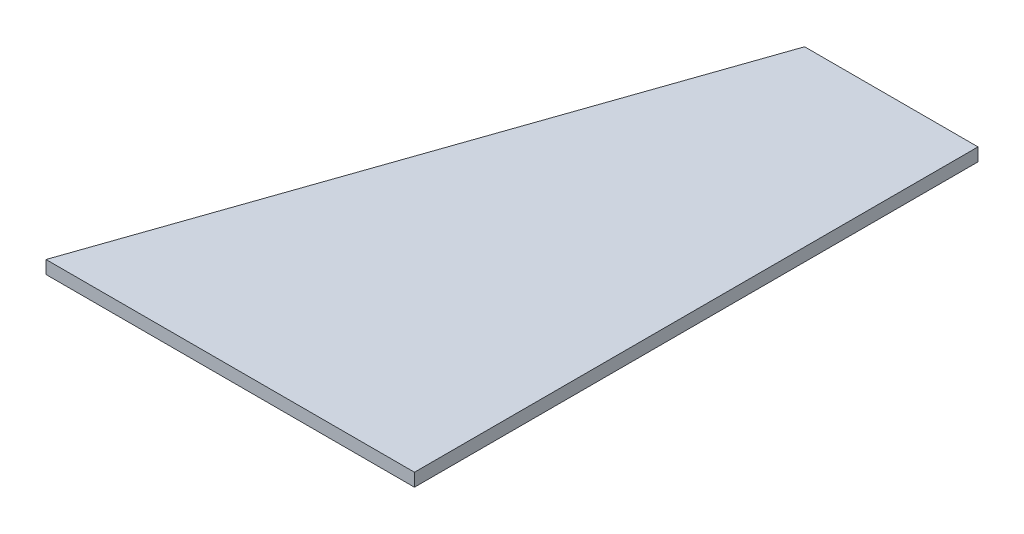
ISO-10303-21;
HEADER;
FILE_DESCRIPTION(('STEP AP214'),'2;1');
FILE_NAME('part.step','',(''),(''),'','','');
FILE_SCHEMA(('AUTOMOTIVE_DESIGN { 1 0 10303 214 1 1 1 1 }'));
ENDSEC;
DATA;
#1=APPLICATION_CONTEXT('core data for automotive mechanical design processes');
#2=APPLICATION_PROTOCOL_DEFINITION('international standard','automotive_design',2000,#1);
#3=PRODUCT_CONTEXT('',#1,'mechanical');
#4=PRODUCT('Part','Part','',(#3));
#5=PRODUCT_RELATED_PRODUCT_CATEGORY('part','',(#4));
#6=PRODUCT_DEFINITION_FORMATION('','',#4);
#7=PRODUCT_DEFINITION_CONTEXT('part definition',#1,'design');
#8=PRODUCT_DEFINITION('design','',#6,#7);
#9=PRODUCT_DEFINITION_SHAPE('','',#8);
#10=(LENGTH_UNIT() NAMED_UNIT(*) SI_UNIT(.MILLI.,.METRE.));
#11=(NAMED_UNIT(*) PLANE_ANGLE_UNIT() SI_UNIT($,.RADIAN.));
#12=(NAMED_UNIT(*) SI_UNIT($,.STERADIAN.) SOLID_ANGLE_UNIT());
#13=UNCERTAINTY_MEASURE_WITH_UNIT(LENGTH_MEASURE(1.E-05),#10,'distance_accuracy_value','');
#14=(GEOMETRIC_REPRESENTATION_CONTEXT(3) GLOBAL_UNCERTAINTY_ASSIGNED_CONTEXT((#13)) GLOBAL_UNIT_ASSIGNED_CONTEXT((#10,
#11,#12)) REPRESENTATION_CONTEXT('',''));
#15=CARTESIAN_POINT('',(0.,0.,0.));
#16=DIRECTION('',(0.,0.,1.));
#17=DIRECTION('',(1.,0.,0.));
#18=AXIS2_PLACEMENT_3D('',#15,#16,#17);
#19=CARTESIAN_POINT('',(1.80411241501588E-13,3.,-260.));
#20=DIRECTION('',(0.,0.,1.));
#21=DIRECTION('',(1.,0.,0.));
#22=AXIS2_PLACEMENT_3D('',#19,#20,#21);
#23=PLANE('',#22);
#24=DIRECTION('',(-1.,0.,0.));
#25=VECTOR('',#24,1.);
#26=CARTESIAN_POINT('',(1.80411241501588E-13,-3.,-260.));
#27=LINE('',#26,#25);
#28=CARTESIAN_POINT('',(170.,-3.,-260.));
#29=VERTEX_POINT('',#28);
#30=CARTESIAN_POINT('',(90.,-3.,-260.));
#31=VERTEX_POINT('',#30);
#32=EDGE_CURVE('E107',#29,#31,#27,.T.);
#33=ORIENTED_EDGE('',*,*,#32,.T.);
#34=DIRECTION('',(0.,-1.,0.));
#35=VECTOR('',#34,1.);
#36=CARTESIAN_POINT('',(90.,3.,-260.));
#37=LINE('',#36,#35);
#38=CARTESIAN_POINT('',(90.,3.,-260.));
#39=VERTEX_POINT('',#38);
#40=EDGE_CURVE('E11',#39,#31,#37,.T.);
#41=ORIENTED_EDGE('',*,*,#40,.F.);
#42=DIRECTION('',(-1.,0.,0.));
#43=VECTOR('',#42,1.);
#44=CARTESIAN_POINT('',(1.80411241501588E-13,3.,-260.));
#45=LINE('',#44,#43);
#46=CARTESIAN_POINT('',(170.,3.,-260.));
#47=VERTEX_POINT('',#46);
#48=EDGE_CURVE('E95',#47,#39,#45,.T.);
#49=ORIENTED_EDGE('',*,*,#48,.F.);
#50=DIRECTION('',(0.,-1.,0.));
#51=VECTOR('',#50,1.);
#52=CARTESIAN_POINT('',(170.,3.,-260.));
#53=LINE('',#52,#51);
#54=EDGE_CURVE('E103',#47,#29,#53,.T.);
#55=ORIENTED_EDGE('',*,*,#54,.T.);
#56=EDGE_LOOP('',(#33,#41,#49,#55));
#57=FACE_BOUND('',#56,.T.);
#58=ADVANCED_FACE('F44',(#57),#23,.F.);
#59=CARTESIAN_POINT('',(0.,3.,0.));
#60=DIRECTION('',(0.944986073440258,0.,0.327110563883166));
#61=DIRECTION('',(0.327110563883166,0.,-0.944986073440258));
#62=AXIS2_PLACEMENT_3D('',#59,#60,#61);
#63=PLANE('',#62);
#64=DIRECTION('',(-0.327110563883166,0.,0.944986073440258));
#65=VECTOR('',#64,1.);
#66=CARTESIAN_POINT('',(0.,-3.,0.));
#67=LINE('',#66,#65);
#68=CARTESIAN_POINT('',(0.,-3.,0.));
#69=VERTEX_POINT('',#68);
#70=EDGE_CURVE('E99',#31,#69,#67,.T.);
#71=ORIENTED_EDGE('',*,*,#70,.T.);
#72=DIRECTION('',(0.,-1.,0.));
#73=VECTOR('',#72,1.);
#74=CARTESIAN_POINT('',(0.,3.,0.));
#75=LINE('',#74,#73);
#76=CARTESIAN_POINT('',(0.,3.,0.));
#77=VERTEX_POINT('',#76);
#78=EDGE_CURVE('E52',#77,#69,#75,.T.);
#79=ORIENTED_EDGE('',*,*,#78,.F.);
#80=DIRECTION('',(-0.327110563883166,0.,0.944986073440258));
#81=VECTOR('',#80,1.);
#82=CARTESIAN_POINT('',(0.,3.,0.));
#83=LINE('',#82,#81);
#84=EDGE_CURVE('E90',#39,#77,#83,.T.);
#85=ORIENTED_EDGE('',*,*,#84,.F.);
#86=ORIENTED_EDGE('',*,*,#40,.T.);
#87=EDGE_LOOP('',(#71,#79,#85,#86));
#88=FACE_BOUND('',#87,.T.);
#89=ADVANCED_FACE('F98',(#88),#63,.F.);
#90=CARTESIAN_POINT('',(0.,3.,0.));
#91=DIRECTION('',(0.,0.,-1.));
#92=DIRECTION('',(-1.,0.,0.));
#93=AXIS2_PLACEMENT_3D('',#90,#91,#92);
#94=PLANE('',#93);
#95=DIRECTION('',(1.,0.,0.));
#96=VECTOR('',#95,1.);
#97=CARTESIAN_POINT('',(0.,-3.,0.));
#98=LINE('',#97,#96);
#99=CARTESIAN_POINT('',(170.,-3.,0.));
#100=VERTEX_POINT('',#99);
#101=EDGE_CURVE('E77',#69,#100,#98,.T.);
#102=ORIENTED_EDGE('',*,*,#101,.T.);
#103=DIRECTION('',(0.,-1.,0.));
#104=VECTOR('',#103,1.);
#105=CARTESIAN_POINT('',(170.,3.,0.));
#106=LINE('',#105,#104);
#107=CARTESIAN_POINT('',(170.,3.,0.));
#108=VERTEX_POINT('',#107);
#109=EDGE_CURVE('E100',#108,#100,#106,.T.);
#110=ORIENTED_EDGE('',*,*,#109,.F.);
#111=DIRECTION('',(1.,0.,0.));
#112=VECTOR('',#111,1.);
#113=CARTESIAN_POINT('',(0.,3.,0.));
#114=LINE('',#113,#112);
#115=EDGE_CURVE('E93',#77,#108,#114,.T.);
#116=ORIENTED_EDGE('',*,*,#115,.F.);
#117=ORIENTED_EDGE('',*,*,#78,.T.);
#118=EDGE_LOOP('',(#102,#110,#116,#117));
#119=FACE_BOUND('',#118,.T.);
#120=ADVANCED_FACE('F101',(#119),#94,.F.);
#121=CARTESIAN_POINT('',(170.,3.,0.));
#122=DIRECTION('',(-1.,0.,0.));
#123=DIRECTION('',(0.,0.,1.));
#124=AXIS2_PLACEMENT_3D('',#121,#122,#123);
#125=PLANE('',#124);
#126=DIRECTION('',(0.,0.,-1.));
#127=VECTOR('',#126,1.);
#128=CARTESIAN_POINT('',(170.,-3.,0.));
#129=LINE('',#128,#127);
#130=EDGE_CURVE('E83',#100,#29,#129,.T.);
#131=ORIENTED_EDGE('',*,*,#130,.T.);
#132=ORIENTED_EDGE('',*,*,#54,.F.);
#133=DIRECTION('',(0.,0.,-1.));
#134=VECTOR('',#133,1.);
#135=CARTESIAN_POINT('',(170.,3.,0.));
#136=LINE('',#135,#134);
#137=EDGE_CURVE('E60',#108,#47,#136,.T.);
#138=ORIENTED_EDGE('',*,*,#137,.F.);
#139=ORIENTED_EDGE('',*,*,#109,.T.);
#140=EDGE_LOOP('',(#131,#132,#138,#139));
#141=FACE_BOUND('',#140,.T.);
#142=ADVANCED_FACE('F114',(#141),#125,.F.);
#143=CARTESIAN_POINT('',(0.,3.,0.));
#144=DIRECTION('',(0.,1.,0.));
#145=DIRECTION('',(0.,0.,1.));
#146=AXIS2_PLACEMENT_3D('',#143,#144,#145);
#147=PLANE('',#146);
#148=ORIENTED_EDGE('',*,*,#48,.T.);
#149=ORIENTED_EDGE('',*,*,#84,.T.);
#150=ORIENTED_EDGE('',*,*,#115,.T.);
#151=ORIENTED_EDGE('',*,*,#137,.T.);
#152=EDGE_LOOP('',(#148,#149,#150,#151));
#153=FACE_BOUND('',#152,.T.);
#154=ADVANCED_FACE('F91',(#153),#147,.T.);
#155=CARTESIAN_POINT('',(0.,-3.,0.));
#156=DIRECTION('',(0.,1.,0.));
#157=DIRECTION('',(0.,0.,1.));
#158=AXIS2_PLACEMENT_3D('',#155,#156,#157);
#159=PLANE('',#158);
#160=ORIENTED_EDGE('',*,*,#32,.F.);
#161=ORIENTED_EDGE('',*,*,#130,.F.);
#162=ORIENTED_EDGE('',*,*,#101,.F.);
#163=ORIENTED_EDGE('',*,*,#70,.F.);
#164=EDGE_LOOP('',(#160,#161,#162,#163));
#165=FACE_BOUND('',#164,.T.);
#166=ADVANCED_FACE('F117',(#165),#159,.F.);
#167=CLOSED_SHELL('',(#58,#89,#120,#142,#154,#166));
#168=MANIFOLD_SOLID_BREP('B2',#167);
#169=ADVANCED_BREP_SHAPE_REPRESENTATION('',(#18,#168),#14);
#170=SHAPE_DEFINITION_REPRESENTATION(#9,#169);
ENDSEC;
END-ISO-10303-21;
